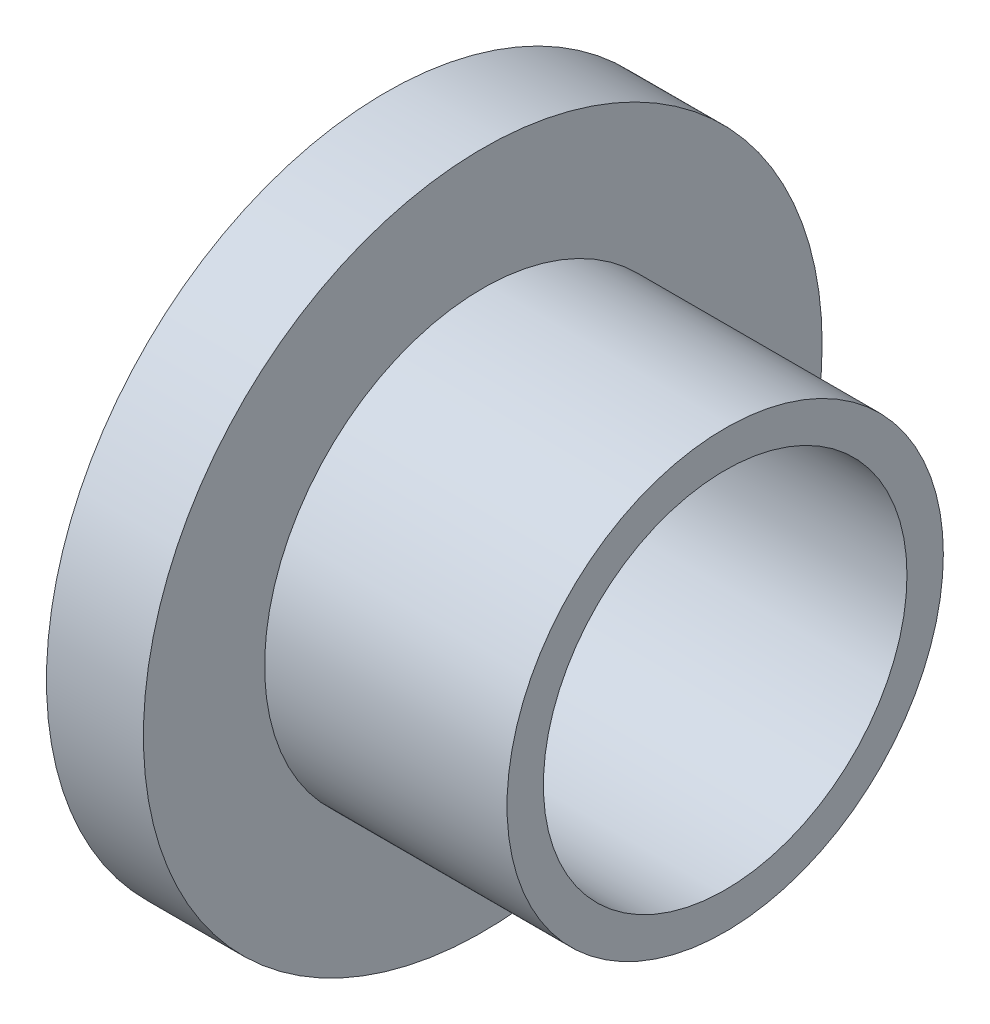
ISO-10303-21;
HEADER;
FILE_DESCRIPTION(('STEP AP214'),'2;1');
FILE_NAME('part.step','',(''),(''),'','','');
FILE_SCHEMA(('AUTOMOTIVE_DESIGN { 1 0 10303 214 1 1 1 1 }'));
ENDSEC;
DATA;
#1=APPLICATION_CONTEXT('core data for automotive mechanical design processes');
#2=APPLICATION_PROTOCOL_DEFINITION('international standard','automotive_design',2000,#1);
#3=PRODUCT_CONTEXT('',#1,'mechanical');
#4=PRODUCT('Part','Part','',(#3));
#5=PRODUCT_RELATED_PRODUCT_CATEGORY('part','',(#4));
#6=PRODUCT_DEFINITION_FORMATION('','',#4);
#7=PRODUCT_DEFINITION_CONTEXT('part definition',#1,'design');
#8=PRODUCT_DEFINITION('design','',#6,#7);
#9=PRODUCT_DEFINITION_SHAPE('','',#8);
#10=(LENGTH_UNIT() NAMED_UNIT(*) SI_UNIT(.MILLI.,.METRE.));
#11=(NAMED_UNIT(*) PLANE_ANGLE_UNIT() SI_UNIT($,.RADIAN.));
#12=(NAMED_UNIT(*) SI_UNIT($,.STERADIAN.) SOLID_ANGLE_UNIT());
#13=UNCERTAINTY_MEASURE_WITH_UNIT(LENGTH_MEASURE(1.E-05),#10,'distance_accuracy_value','');
#14=(GEOMETRIC_REPRESENTATION_CONTEXT(3) GLOBAL_UNCERTAINTY_ASSIGNED_CONTEXT((#13)) GLOBAL_UNIT_ASSIGNED_CONTEXT((#10,
#11,#12)) REPRESENTATION_CONTEXT('',''));
#15=CARTESIAN_POINT('',(0.,0.,0.));
#16=DIRECTION('',(0.,0.,1.));
#17=DIRECTION('',(1.,0.,0.));
#18=AXIS2_PLACEMENT_3D('',#15,#16,#17);
#19=CARTESIAN_POINT('',(70.,0.,0.));
#20=DIRECTION('',(-1.,0.,0.));
#21=DIRECTION('',(0.,0.,1.));
#22=AXIS2_PLACEMENT_3D('',#19,#20,#21);
#23=CYLINDRICAL_SURFACE('',#22,70.);
#24=CARTESIAN_POINT('',(0.,0.,0.));
#25=DIRECTION('',(1.,0.,0.));
#26=DIRECTION('',(0.,0.,-1.));
#27=AXIS2_PLACEMENT_3D('',#24,#25,#26);
#28=CIRCLE('',#27,70.);
#29=CARTESIAN_POINT('',(0.,0.,-70.));
#30=VERTEX_POINT('',#29);
#31=EDGE_CURVE('E12',#30,#30,#28,.T.);
#32=ORIENTED_EDGE('',*,*,#31,.T.);
#33=EDGE_LOOP('',(#32));
#34=FACE_BOUND('',#33,.T.);
#35=CARTESIAN_POINT('',(20.,0.,0.));
#36=DIRECTION('',(1.,0.,0.));
#37=DIRECTION('',(0.,0.,-1.));
#38=AXIS2_PLACEMENT_3D('',#35,#36,#37);
#39=CIRCLE('',#38,70.);
#40=CARTESIAN_POINT('',(20.,0.,-70.));
#41=VERTEX_POINT('',#40);
#42=EDGE_CURVE('E40',#41,#41,#39,.T.);
#43=ORIENTED_EDGE('',*,*,#42,.F.);
#44=EDGE_LOOP('',(#43));
#45=FACE_BOUND('',#44,.T.);
#46=ADVANCED_FACE('F37',(#34,#45),#23,.T.);
#47=CARTESIAN_POINT('',(70.,0.,0.));
#48=DIRECTION('',(1.,0.,0.));
#49=DIRECTION('',(0.,0.,-1.));
#50=AXIS2_PLACEMENT_3D('',#47,#48,#49);
#51=PLANE('',#50);
#52=CARTESIAN_POINT('',(70.,0.,0.));
#53=DIRECTION('',(1.,0.,0.));
#54=DIRECTION('',(0.,0.,-1.));
#55=AXIS2_PLACEMENT_3D('',#52,#53,#54);
#56=CIRCLE('',#55,37.5);
#57=CARTESIAN_POINT('',(70.,0.,-37.5));
#58=VERTEX_POINT('',#57);
#59=EDGE_CURVE('E48',#58,#58,#56,.T.);
#60=ORIENTED_EDGE('',*,*,#59,.F.);
#61=EDGE_LOOP('',(#60));
#62=FACE_BOUND('',#61,.T.);
#63=CARTESIAN_POINT('',(70.,0.,0.));
#64=DIRECTION('',(1.,0.,0.));
#65=DIRECTION('',(0.,0.,-1.));
#66=AXIS2_PLACEMENT_3D('',#63,#64,#65);
#67=CIRCLE('',#66,45.);
#68=CARTESIAN_POINT('',(70.,0.,-45.));
#69=VERTEX_POINT('',#68);
#70=EDGE_CURVE('E56',#69,#69,#67,.T.);
#71=ORIENTED_EDGE('',*,*,#70,.T.);
#72=EDGE_LOOP('',(#71));
#73=FACE_BOUND('',#72,.T.);
#74=ADVANCED_FACE('F60',(#62,#73),#51,.T.);
#75=CARTESIAN_POINT('',(0.,0.,0.));
#76=DIRECTION('',(1.,0.,0.));
#77=DIRECTION('',(0.,0.,-1.));
#78=AXIS2_PLACEMENT_3D('',#75,#76,#77);
#79=PLANE('',#78);
#80=CARTESIAN_POINT('',(0.,0.,0.));
#81=DIRECTION('',(1.,0.,0.));
#82=DIRECTION('',(0.,0.,-1.));
#83=AXIS2_PLACEMENT_3D('',#80,#81,#82);
#84=CIRCLE('',#83,37.5);
#85=CARTESIAN_POINT('',(0.,0.,-37.5));
#86=VERTEX_POINT('',#85);
#87=EDGE_CURVE('E44',#86,#86,#84,.T.);
#88=ORIENTED_EDGE('',*,*,#87,.T.);
#89=EDGE_LOOP('',(#88));
#90=FACE_BOUND('',#89,.T.);
#91=ORIENTED_EDGE('',*,*,#31,.F.);
#92=EDGE_LOOP('',(#91));
#93=FACE_BOUND('',#92,.T.);
#94=ADVANCED_FACE('F79',(#90,#93),#79,.F.);
#95=CARTESIAN_POINT('',(0.,0.,0.));
#96=DIRECTION('',(1.,0.,0.));
#97=DIRECTION('',(0.,0.,-1.));
#98=AXIS2_PLACEMENT_3D('',#95,#96,#97);
#99=CYLINDRICAL_SURFACE('',#98,37.5);
#100=ORIENTED_EDGE('',*,*,#87,.F.);
#101=EDGE_LOOP('',(#100));
#102=FACE_BOUND('',#101,.T.);
#103=ORIENTED_EDGE('',*,*,#59,.T.);
#104=EDGE_LOOP('',(#103));
#105=FACE_BOUND('',#104,.T.);
#106=ADVANCED_FACE('F70',(#102,#105),#99,.F.);
#107=CARTESIAN_POINT('',(20.,0.,0.));
#108=DIRECTION('',(1.,0.,0.));
#109=DIRECTION('',(0.,0.,-1.));
#110=AXIS2_PLACEMENT_3D('',#107,#108,#109);
#111=PLANE('',#110);
#112=CARTESIAN_POINT('',(20.,0.,0.));
#113=DIRECTION('',(1.,0.,0.));
#114=DIRECTION('',(0.,0.,-1.));
#115=AXIS2_PLACEMENT_3D('',#112,#113,#114);
#116=CIRCLE('',#115,45.);
#117=CARTESIAN_POINT('',(20.,0.,-45.));
#118=VERTEX_POINT('',#117);
#119=EDGE_CURVE('E53',#118,#118,#116,.F.);
#120=ORIENTED_EDGE('',*,*,#119,.T.);
#121=EDGE_LOOP('',(#120));
#122=FACE_BOUND('',#121,.T.);
#123=ORIENTED_EDGE('',*,*,#42,.T.);
#124=EDGE_LOOP('',(#123));
#125=FACE_BOUND('',#124,.T.);
#126=ADVANCED_FACE('F64',(#122,#125),#111,.T.);
#127=CARTESIAN_POINT('',(-199.969797719556,0.,0.));
#128=DIRECTION('',(1.,0.,0.));
#129=DIRECTION('',(0.,0.,-1.));
#130=AXIS2_PLACEMENT_3D('',#127,#128,#129);
#131=CYLINDRICAL_SURFACE('',#130,45.);
#132=ORIENTED_EDGE('',*,*,#119,.F.);
#133=EDGE_LOOP('',(#132));
#134=FACE_BOUND('',#133,.T.);
#135=ORIENTED_EDGE('',*,*,#70,.F.);
#136=EDGE_LOOP('',(#135));
#137=FACE_BOUND('',#136,.T.);
#138=ADVANCED_FACE('F62',(#134,#137),#131,.T.);
#139=CLOSED_SHELL('',(#46,#74,#94,#106,#126,#138));
#140=MANIFOLD_SOLID_BREP('B2',#139);
#141=ADVANCED_BREP_SHAPE_REPRESENTATION('',(#18,#140),#14);
#142=SHAPE_DEFINITION_REPRESENTATION(#9,#141);
ENDSEC;
END-ISO-10303-21;
